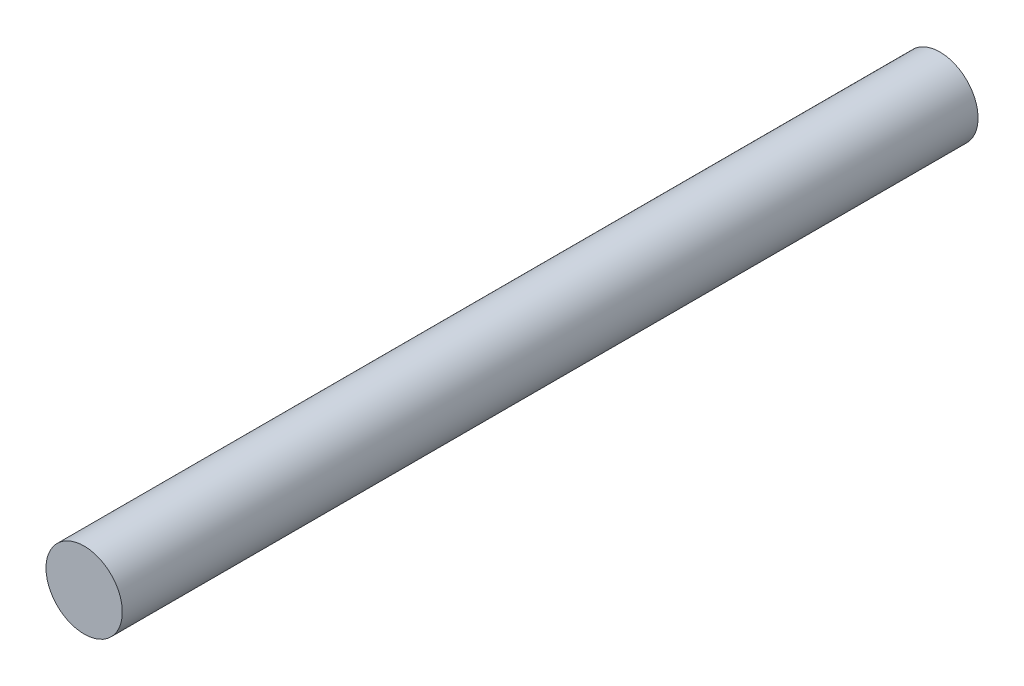
ISO-10303-21;
HEADER;
FILE_DESCRIPTION(('STEP AP214'),'2;1');
FILE_NAME('part.step','',(''),(''),'','','');
FILE_SCHEMA(('AUTOMOTIVE_DESIGN { 1 0 10303 214 1 1 1 1 }'));
ENDSEC;
DATA;
#1=APPLICATION_CONTEXT('core data for automotive mechanical design processes');
#2=APPLICATION_PROTOCOL_DEFINITION('international standard','automotive_design',2000,#1);
#3=PRODUCT_CONTEXT('',#1,'mechanical');
#4=PRODUCT('Part','Part','',(#3));
#5=PRODUCT_RELATED_PRODUCT_CATEGORY('part','',(#4));
#6=PRODUCT_DEFINITION_FORMATION('','',#4);
#7=PRODUCT_DEFINITION_CONTEXT('part definition',#1,'design');
#8=PRODUCT_DEFINITION('design','',#6,#7);
#9=PRODUCT_DEFINITION_SHAPE('','',#8);
#10=(LENGTH_UNIT() NAMED_UNIT(*) SI_UNIT(.MILLI.,.METRE.));
#11=(NAMED_UNIT(*) PLANE_ANGLE_UNIT() SI_UNIT($,.RADIAN.));
#12=(NAMED_UNIT(*) SI_UNIT($,.STERADIAN.) SOLID_ANGLE_UNIT());
#13=UNCERTAINTY_MEASURE_WITH_UNIT(LENGTH_MEASURE(1.E-05),#10,'distance_accuracy_value','');
#14=(GEOMETRIC_REPRESENTATION_CONTEXT(3) GLOBAL_UNCERTAINTY_ASSIGNED_CONTEXT((#13)) GLOBAL_UNIT_ASSIGNED_CONTEXT((#10,
#11,#12)) REPRESENTATION_CONTEXT('',''));
#15=CARTESIAN_POINT('',(0.,0.,0.));
#16=DIRECTION('',(0.,0.,1.));
#17=DIRECTION('',(1.,0.,0.));
#18=AXIS2_PLACEMENT_3D('',#15,#16,#17);
#19=CARTESIAN_POINT('',(0.,0.,58.1));
#20=DIRECTION('',(0.,0.,-1.));
#21=DIRECTION('',(-1.,0.,0.));
#22=AXIS2_PLACEMENT_3D('',#19,#20,#21);
#23=CYLINDRICAL_SURFACE('',#22,2.5908);
#24=CARTESIAN_POINT('',(0.,0.,58.1));
#25=DIRECTION('',(0.,0.,1.));
#26=DIRECTION('',(1.,0.,0.));
#27=AXIS2_PLACEMENT_3D('',#24,#25,#26);
#28=CIRCLE('',#27,2.5908);
#29=CARTESIAN_POINT('',(-2.5908,0.,58.1));
#30=VERTEX_POINT('',#29);
#31=EDGE_CURVE('E10',#30,#30,#28,.T.);
#32=CARTESIAN_POINT('',(0.,0.,0.));
#33=DIRECTION('',(0.,0.,1.));
#34=DIRECTION('',(1.,0.,0.));
#35=AXIS2_PLACEMENT_3D('',#32,#33,#34);
#36=CIRCLE('',#35,2.5908);
#37=CARTESIAN_POINT('',(-2.5908,0.,0.));
#38=VERTEX_POINT('',#37);
#39=EDGE_CURVE('E36',#38,#38,#36,.T.);
#40=CARTESIAN_POINT('',(-2.5908,0.,58.1));
#41=CARTESIAN_POINT('',(-2.5908,0.,57.4947916666667));
#42=CARTESIAN_POINT('',(-2.5908,0.,56.8895833333333));
#43=CARTESIAN_POINT('',(-2.5908,0.,55.6791666666667));
#44=CARTESIAN_POINT('',(-2.5908,0.,55.0739583333333));
#45=CARTESIAN_POINT('',(-2.5908,0.,53.8635416666667));
#46=CARTESIAN_POINT('',(-2.5908,0.,53.2583333333333));
#47=CARTESIAN_POINT('',(-2.5908,0.,52.0479166666667));
#48=CARTESIAN_POINT('',(-2.5908,0.,51.4427083333333));
#49=CARTESIAN_POINT('',(-2.5908,0.,50.2322916666667));
#50=CARTESIAN_POINT('',(-2.5908,0.,49.6270833333333));
#51=CARTESIAN_POINT('',(-2.5908,0.,48.4166666666667));
#52=CARTESIAN_POINT('',(-2.5908,0.,47.8114583333333));
#53=CARTESIAN_POINT('',(-2.5908,0.,46.6010416666667));
#54=CARTESIAN_POINT('',(-2.5908,0.,45.9958333333333));
#55=CARTESIAN_POINT('',(-2.5908,0.,44.7854166666667));
#56=CARTESIAN_POINT('',(-2.5908,0.,44.1802083333333));
#57=CARTESIAN_POINT('',(-2.5908,0.,42.9697916666667));
#58=CARTESIAN_POINT('',(-2.5908,0.,42.3645833333333));
#59=CARTESIAN_POINT('',(-2.5908,0.,41.1541666666667));
#60=CARTESIAN_POINT('',(-2.5908,0.,40.5489583333333));
#61=CARTESIAN_POINT('',(-2.5908,0.,39.3385416666667));
#62=CARTESIAN_POINT('',(-2.5908,0.,38.7333333333333));
#63=CARTESIAN_POINT('',(-2.5908,0.,37.5229166666667));
#64=CARTESIAN_POINT('',(-2.5908,0.,36.9177083333333));
#65=CARTESIAN_POINT('',(-2.5908,0.,35.7072916666667));
#66=CARTESIAN_POINT('',(-2.5908,0.,35.1020833333333));
#67=CARTESIAN_POINT('',(-2.5908,0.,33.8916666666667));
#68=CARTESIAN_POINT('',(-2.5908,0.,33.2864583333333));
#69=CARTESIAN_POINT('',(-2.5908,0.,32.0760416666667));
#70=CARTESIAN_POINT('',(-2.5908,0.,31.4708333333333));
#71=CARTESIAN_POINT('',(-2.5908,0.,30.2604166666667));
#72=CARTESIAN_POINT('',(-2.5908,0.,29.6552083333333));
#73=CARTESIAN_POINT('',(-2.5908,0.,28.4447916666667));
#74=CARTESIAN_POINT('',(-2.5908,0.,27.8395833333333));
#75=CARTESIAN_POINT('',(-2.5908,0.,26.6291666666667));
#76=CARTESIAN_POINT('',(-2.5908,0.,26.0239583333333));
#77=CARTESIAN_POINT('',(-2.5908,0.,24.8135416666667));
#78=CARTESIAN_POINT('',(-2.5908,0.,24.2083333333333));
#79=CARTESIAN_POINT('',(-2.5908,0.,22.9979166666667));
#80=CARTESIAN_POINT('',(-2.5908,0.,22.3927083333333));
#81=CARTESIAN_POINT('',(-2.5908,0.,21.1822916666667));
#82=CARTESIAN_POINT('',(-2.5908,0.,20.5770833333333));
#83=CARTESIAN_POINT('',(-2.5908,0.,19.3666666666667));
#84=CARTESIAN_POINT('',(-2.5908,0.,18.7614583333333));
#85=CARTESIAN_POINT('',(-2.5908,0.,17.5510416666667));
#86=CARTESIAN_POINT('',(-2.5908,0.,16.9458333333333));
#87=CARTESIAN_POINT('',(-2.5908,0.,15.7354166666667));
#88=CARTESIAN_POINT('',(-2.5908,0.,15.1302083333333));
#89=CARTESIAN_POINT('',(-2.5908,0.,13.9197916666667));
#90=CARTESIAN_POINT('',(-2.5908,0.,13.3145833333333));
#91=CARTESIAN_POINT('',(-2.5908,0.,12.1041666666667));
#92=CARTESIAN_POINT('',(-2.5908,0.,11.4989583333333));
#93=CARTESIAN_POINT('',(-2.5908,0.,10.2885416666667));
#94=CARTESIAN_POINT('',(-2.5908,0.,9.68333333333333));
#95=CARTESIAN_POINT('',(-2.5908,0.,8.47291666666666));
#96=CARTESIAN_POINT('',(-2.5908,0.,7.86770833333333));
#97=CARTESIAN_POINT('',(-2.5908,0.,6.65729166666666));
#98=CARTESIAN_POINT('',(-2.5908,0.,6.05208333333333));
#99=CARTESIAN_POINT('',(-2.5908,0.,4.84166666666666));
#100=CARTESIAN_POINT('',(-2.5908,0.,4.23645833333333));
#101=CARTESIAN_POINT('',(-2.5908,0.,3.02604166666666));
#102=CARTESIAN_POINT('',(-2.5908,0.,2.42083333333333));
#103=CARTESIAN_POINT('',(-2.5908,0.,1.21041666666666));
#104=CARTESIAN_POINT('',(-2.5908,0.,0.605208333333327));
#105=CARTESIAN_POINT('',(-2.5908,0.,0.));
#106=B_SPLINE_CURVE_WITH_KNOTS('',3,(#40,#41,#42,#43,#44,#45,#46,#47,#48,#49,#50,#51,#52,#53,
#54,#55,#56,#57,#58,#59,#60,#61,#62,#63,#64,#65,#66,#67,#68,#69,#70,#71,#72,#73,#74,#75,#76,#77,
#78,#79,#80,#81,#82,#83,#84,#85,#86,#87,#88,#89,#90,#91,#92,#93,#94,#95,#96,#97,#98,#99,#100,
#101,#102,#103,#104,#105),.UNSPECIFIED.,.F.,.F.,(4,2,2,2,2,2,2,2,2,2,2,2,2,2,2,2,2,2,2,2,2,2,2,
2,2,2,2,2,2,2,2,2,4),(0.,1.815625,3.63125,5.446875,7.2625,9.07812500000001,10.89375,12.709375,
14.525,16.340625,18.15625,19.971875,21.7875,23.603125,25.41875,27.234375,29.05,30.865625,
32.68125,34.496875,36.3125,38.128125,39.94375,41.759375,43.575,45.390625,47.20625,49.021875,
50.8375,52.653125,54.46875,56.284375,58.1),.UNSPECIFIED.);
#107=EDGE_CURVE('BSEAM33',#30,#38,#106,.T.);
#108=ORIENTED_EDGE('',*,*,#31,.F.);
#109=ORIENTED_EDGE('',*,*,#39,.T.);
#110=ORIENTED_EDGE('',*,*,#107,.T.);
#111=ORIENTED_EDGE('',*,*,#107,.F.);
#112=EDGE_LOOP('',(#108,#110,#109,#111));
#113=FACE_BOUND('',#112,.T.);
#114=ADVANCED_FACE('F33',(#113),#23,.T.);
#115=CARTESIAN_POINT('',(0.,0.,58.1));
#116=DIRECTION('',(0.,0.,1.));
#117=DIRECTION('',(1.,0.,0.));
#118=AXIS2_PLACEMENT_3D('',#115,#116,#117);
#119=PLANE('',#118);
#120=ORIENTED_EDGE('',*,*,#31,.T.);
#121=EDGE_LOOP('',(#120));
#122=FACE_BOUND('',#121,.T.);
#123=ADVANCED_FACE('F48',(#122),#119,.T.);
#124=CARTESIAN_POINT('',(0.,0.,0.));
#125=DIRECTION('',(0.,0.,1.));
#126=DIRECTION('',(1.,0.,0.));
#127=AXIS2_PLACEMENT_3D('',#124,#125,#126);
#128=PLANE('',#127);
#129=ORIENTED_EDGE('',*,*,#39,.F.);
#130=EDGE_LOOP('',(#129));
#131=FACE_BOUND('',#130,.T.);
#132=ADVANCED_FACE('F46',(#131),#128,.F.);
#133=CLOSED_SHELL('',(#114,#123,#132));
#134=MANIFOLD_SOLID_BREP('B2',#133);
#135=ADVANCED_BREP_SHAPE_REPRESENTATION('',(#18,#134),#14);
#136=SHAPE_DEFINITION_REPRESENTATION(#9,#135);
ENDSEC;
END-ISO-10303-21;
